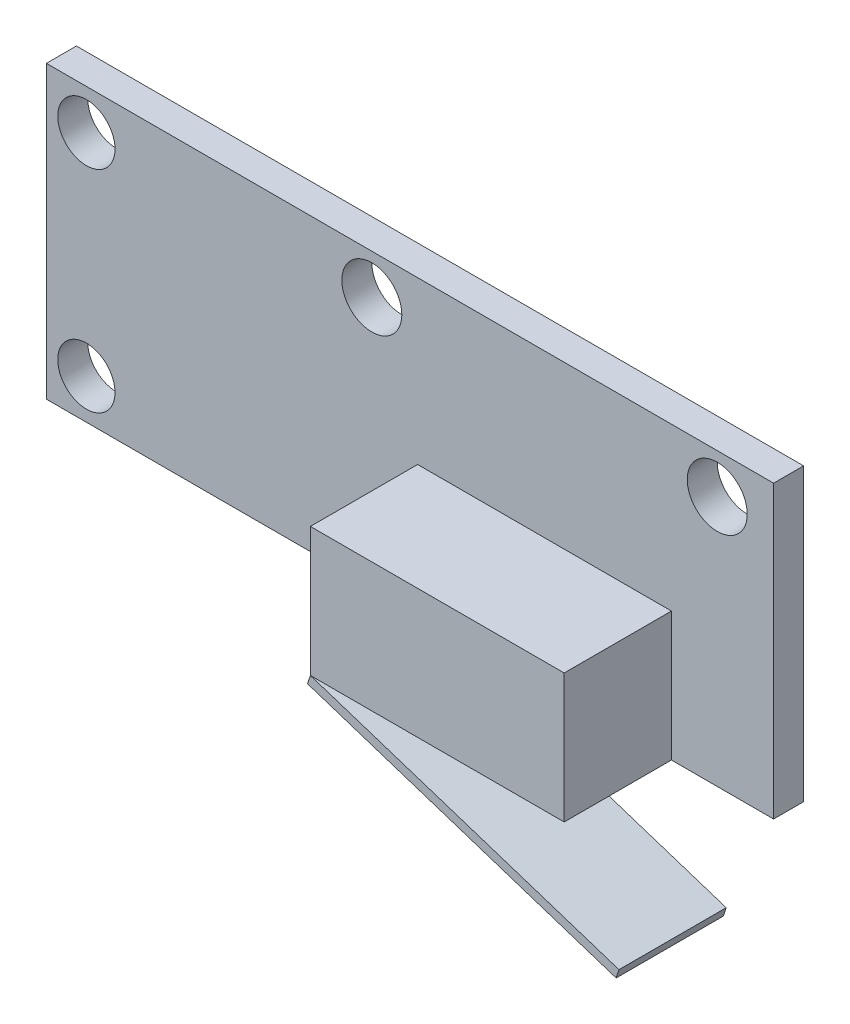
ISO-10303-21;
HEADER;
FILE_DESCRIPTION(('STEP AP214'),'2;1');
FILE_NAME('part.step','',(''),(''),'','','');
FILE_SCHEMA(('AUTOMOTIVE_DESIGN { 1 0 10303 214 1 1 1 1 }'));
ENDSEC;
DATA;
#1=APPLICATION_CONTEXT('core data for automotive mechanical design processes');
#2=APPLICATION_PROTOCOL_DEFINITION('international standard','automotive_design',2000,#1);
#3=PRODUCT_CONTEXT('',#1,'mechanical');
#4=PRODUCT('Part','Part','',(#3));
#5=PRODUCT_RELATED_PRODUCT_CATEGORY('part','',(#4));
#6=PRODUCT_DEFINITION_FORMATION('','',#4);
#7=PRODUCT_DEFINITION_CONTEXT('part definition',#1,'design');
#8=PRODUCT_DEFINITION('design','',#6,#7);
#9=PRODUCT_DEFINITION_SHAPE('','',#8);
#10=(LENGTH_UNIT() NAMED_UNIT(*) SI_UNIT(.MILLI.,.METRE.));
#11=(NAMED_UNIT(*) PLANE_ANGLE_UNIT() SI_UNIT($,.RADIAN.));
#12=(NAMED_UNIT(*) SI_UNIT($,.STERADIAN.) SOLID_ANGLE_UNIT());
#13=UNCERTAINTY_MEASURE_WITH_UNIT(LENGTH_MEASURE(1.E-05),#10,'distance_accuracy_value','');
#14=(GEOMETRIC_REPRESENTATION_CONTEXT(3) GLOBAL_UNCERTAINTY_ASSIGNED_CONTEXT((#13)) GLOBAL_UNIT_ASSIGNED_CONTEXT((#10,
#11,#12)) REPRESENTATION_CONTEXT('',''));
#15=CARTESIAN_POINT('',(0.,0.,0.));
#16=DIRECTION('',(0.,0.,1.));
#17=DIRECTION('',(1.,0.,0.));
#18=AXIS2_PLACEMENT_3D('',#15,#16,#17);
#19=CARTESIAN_POINT('',(20.2644251272537,-0.47543198853105,7.55));
#20=DIRECTION('',(0.309608942257238,0.9508639770621,0.));
#21=DIRECTION('',(-0.9508639770621,0.309608942257239,0.));
#22=AXIS2_PLACEMENT_3D('',#19,#20,#21);
#23=PLANE('',#22);
#24=DIRECTION('',(0.9508639770621,-0.309608942257239,0.));
#25=VECTOR('',#24,1.);
#26=CARTESIAN_POINT('',(20.2644251272537,-0.47543198853105,1.65));
#27=LINE('',#26,#25);
#28=CARTESIAN_POINT('',(20.2644251272537,-0.47543198853105,1.65));
#29=VERTEX_POINT('',#28);
#30=CARTESIAN_POINT('',(37.2392644095884,-6.00257589341268,1.65));
#31=VERTEX_POINT('',#30);
#32=EDGE_CURVE('E106',#29,#31,#27,.T.);
#33=ORIENTED_EDGE('',*,*,#32,.T.);
#34=DIRECTION('',(0.,0.,-1.));
#35=VECTOR('',#34,1.);
#36=CARTESIAN_POINT('',(37.2392644095884,-6.00257589341268,7.55));
#37=LINE('',#36,#35);
#38=CARTESIAN_POINT('',(37.2392644095884,-6.00257589341268,7.55));
#39=VERTEX_POINT('',#38);
#40=EDGE_CURVE('E12',#39,#31,#37,.T.);
#41=ORIENTED_EDGE('',*,*,#40,.F.);
#42=DIRECTION('',(0.9508639770621,-0.309608942257239,0.));
#43=VECTOR('',#42,1.);
#44=CARTESIAN_POINT('',(20.2644251272537,-0.47543198853105,7.55));
#45=LINE('',#44,#43);
#46=CARTESIAN_POINT('',(20.2644251272537,-0.47543198853105,7.55));
#47=VERTEX_POINT('',#46);
#48=EDGE_CURVE('E83',#47,#39,#45,.T.);
#49=ORIENTED_EDGE('',*,*,#48,.F.);
#50=DIRECTION('',(0.,0.,-1.));
#51=VECTOR('',#50,1.);
#52=CARTESIAN_POINT('',(20.2644251272537,-0.47543198853105,7.55));
#53=LINE('',#52,#51);
#54=EDGE_CURVE('E59',#47,#29,#53,.T.);
#55=ORIENTED_EDGE('',*,*,#54,.T.);
#56=EDGE_LOOP('',(#33,#41,#49,#55));
#57=FACE_BOUND('',#56,.T.);
#58=ADVANCED_FACE('F43',(#57),#23,.F.);
#59=CARTESIAN_POINT('',(37.3940688807171,-5.52714390488163,7.55));
#60=DIRECTION('',(0.950863977062102,-0.309608942257234,0.));
#61=DIRECTION('',(0.309608942257234,0.950863977062102,0.));
#62=AXIS2_PLACEMENT_3D('',#59,#60,#61);
#63=PLANE('',#62);
#64=DIRECTION('',(-0.309608942257234,-0.950863977062102,0.));
#65=VECTOR('',#64,1.);
#66=CARTESIAN_POINT('',(37.3940688807171,-5.52714390488163,1.65));
#67=LINE('',#66,#65);
#68=CARTESIAN_POINT('',(37.3940688807171,-5.52714390488163,1.65));
#69=VERTEX_POINT('',#68);
#70=EDGE_CURVE('E92',#69,#31,#67,.T.);
#71=ORIENTED_EDGE('',*,*,#70,.F.);
#72=DIRECTION('',(0.,0.,-1.));
#73=VECTOR('',#72,1.);
#74=CARTESIAN_POINT('',(37.3940688807171,-5.52714390488163,7.55));
#75=LINE('',#74,#73);
#76=CARTESIAN_POINT('',(37.3940688807171,-5.52714390488163,7.55));
#77=VERTEX_POINT('',#76);
#78=EDGE_CURVE('E51',#77,#69,#75,.T.);
#79=ORIENTED_EDGE('',*,*,#78,.F.);
#80=DIRECTION('',(-0.309608942257234,-0.950863977062102,0.));
#81=VECTOR('',#80,1.);
#82=CARTESIAN_POINT('',(37.3940688807171,-5.52714390488163,7.55));
#83=LINE('',#82,#81);
#84=EDGE_CURVE('E90',#77,#39,#83,.T.);
#85=ORIENTED_EDGE('',*,*,#84,.T.);
#86=ORIENTED_EDGE('',*,*,#40,.T.);
#87=EDGE_LOOP('',(#71,#79,#85,#86));
#88=FACE_BOUND('',#87,.T.);
#89=ADVANCED_FACE('F89',(#88),#63,.T.);
#90=CARTESIAN_POINT('',(20.4192295983823,0.,7.55));
#91=DIRECTION('',(0.309608942257238,0.9508639770621,0.));
#92=DIRECTION('',(-0.9508639770621,0.309608942257239,0.));
#93=AXIS2_PLACEMENT_3D('',#90,#91,#92);
#94=PLANE('',#93);
#95=DIRECTION('',(0.9508639770621,-0.309608942257239,0.));
#96=VECTOR('',#95,1.);
#97=CARTESIAN_POINT('',(20.4192295983823,0.,1.65));
#98=LINE('',#97,#96);
#99=CARTESIAN_POINT('',(20.4192295983823,0.,1.65));
#100=VERTEX_POINT('',#99);
#101=EDGE_CURVE('E109',#100,#69,#98,.T.);
#102=ORIENTED_EDGE('',*,*,#101,.F.);
#103=DIRECTION('',(0.,0.,-1.));
#104=VECTOR('',#103,1.);
#105=CARTESIAN_POINT('',(20.4192295983823,0.,7.55));
#106=LINE('',#105,#104);
#107=CARTESIAN_POINT('',(20.4192295983823,0.,7.55));
#108=VERTEX_POINT('',#107);
#109=EDGE_CURVE('E72',#108,#100,#106,.T.);
#110=ORIENTED_EDGE('',*,*,#109,.F.);
#111=DIRECTION('',(0.9508639770621,-0.309608942257239,0.));
#112=VECTOR('',#111,1.);
#113=CARTESIAN_POINT('',(20.4192295983823,0.,7.55));
#114=LINE('',#113,#112);
#115=EDGE_CURVE('E98',#108,#77,#114,.T.);
#116=ORIENTED_EDGE('',*,*,#115,.T.);
#117=ORIENTED_EDGE('',*,*,#78,.T.);
#118=EDGE_LOOP('',(#102,#110,#116,#117));
#119=FACE_BOUND('',#118,.T.);
#120=ADVANCED_FACE('F100',(#119),#94,.T.);
#121=CARTESIAN_POINT('',(20.2644251272537,-0.47543198853105,7.55));
#122=DIRECTION('',(-0.950863977062099,0.30960894225724,0.));
#123=DIRECTION('',(-0.30960894225724,-0.9508639770621,0.));
#124=AXIS2_PLACEMENT_3D('',#121,#122,#123);
#125=PLANE('',#124);
#126=DIRECTION('',(0.30960894225724,0.950863977062099,0.));
#127=VECTOR('',#126,1.);
#128=CARTESIAN_POINT('',(20.2644251272537,-0.47543198853105,1.65));
#129=LINE('',#128,#127);
#130=EDGE_CURVE('E111',#29,#100,#129,.T.);
#131=ORIENTED_EDGE('',*,*,#130,.F.);
#132=ORIENTED_EDGE('',*,*,#54,.F.);
#133=DIRECTION('',(0.30960894225724,0.950863977062099,0.));
#134=VECTOR('',#133,1.);
#135=CARTESIAN_POINT('',(20.2644251272537,-0.47543198853105,7.55));
#136=LINE('',#135,#134);
#137=EDGE_CURVE('E101',#47,#108,#136,.T.);
#138=ORIENTED_EDGE('',*,*,#137,.T.);
#139=ORIENTED_EDGE('',*,*,#109,.T.);
#140=EDGE_LOOP('',(#131,#132,#138,#139));
#141=FACE_BOUND('',#140,.T.);
#142=ADVANCED_FACE('F117',(#141),#125,.T.);
#143=CARTESIAN_POINT('',(0.,0.,7.55));
#144=DIRECTION('',(0.,0.,-1.));
#145=DIRECTION('',(-1.,0.,0.));
#146=AXIS2_PLACEMENT_3D('',#143,#144,#145);
#147=PLANE('',#146);
#148=ORIENTED_EDGE('',*,*,#48,.T.);
#149=ORIENTED_EDGE('',*,*,#84,.F.);
#150=ORIENTED_EDGE('',*,*,#115,.F.);
#151=ORIENTED_EDGE('',*,*,#137,.F.);
#152=EDGE_LOOP('',(#148,#149,#150,#151));
#153=FACE_BOUND('',#152,.T.);
#154=ADVANCED_FACE('F97',(#153),#147,.F.);
#155=CARTESIAN_POINT('',(0.,0.,1.65));
#156=DIRECTION('',(0.,0.,-1.));
#157=DIRECTION('',(-1.,0.,0.));
#158=AXIS2_PLACEMENT_3D('',#155,#156,#157);
#159=PLANE('',#158);
#160=ORIENTED_EDGE('',*,*,#32,.F.);
#161=ORIENTED_EDGE('',*,*,#130,.T.);
#162=ORIENTED_EDGE('',*,*,#101,.T.);
#163=ORIENTED_EDGE('',*,*,#70,.T.);
#164=EDGE_LOOP('',(#160,#161,#162,#163));
#165=FACE_BOUND('',#164,.T.);
#166=ADVANCED_FACE('F116',(#165),#159,.T.);
#167=CLOSED_SHELL('',(#58,#89,#120,#142,#154,#166));
#168=MANIFOLD_SOLID_BREP('B2',#167);
#169=CARTESIAN_POINT('',(0.,0.,1.65));
#170=DIRECTION('',(0.,0.,-1.));
#171=DIRECTION('',(-1.,0.,0.));
#172=AXIS2_PLACEMENT_3D('',#169,#170,#171);
#173=PLANE('',#172);
#174=CARTESIAN_POINT('',(2.2,2.2,1.65));
#175=DIRECTION('',(0.,0.,1.));
#176=DIRECTION('',(-1.,0.,0.));
#177=AXIS2_PLACEMENT_3D('',#174,#175,#176);
#178=CIRCLE('',#177,1.575);
#179=CARTESIAN_POINT('',(0.625000000000001,2.2,1.65));
#180=VERTEX_POINT('',#179);
#181=EDGE_CURVE('E258',#180,#180,#178,.T.);
#182=ORIENTED_EDGE('',*,*,#181,.F.);
#183=EDGE_LOOP('',(#182));
#184=FACE_BOUND('',#183,.T.);
#185=CARTESIAN_POINT('',(17.9,13.8,1.65));
#186=DIRECTION('',(0.,0.,1.));
#187=DIRECTION('',(1.,0.,0.));
#188=AXIS2_PLACEMENT_3D('',#185,#186,#187);
#189=CIRCLE('',#188,1.65);
#190=CARTESIAN_POINT('',(19.55,13.8,1.65));
#191=VERTEX_POINT('',#190);
#192=EDGE_CURVE('E340',#191,#191,#189,.T.);
#193=ORIENTED_EDGE('',*,*,#192,.F.);
#194=EDGE_LOOP('',(#193));
#195=FACE_BOUND('',#194,.T.);
#196=CARTESIAN_POINT('',(36.9,13.8,1.65));
#197=DIRECTION('',(0.,0.,1.));
#198=DIRECTION('',(1.,0.,0.));
#199=AXIS2_PLACEMENT_3D('',#196,#197,#198);
#200=CIRCLE('',#199,1.65);
#201=CARTESIAN_POINT('',(38.55,13.8,1.65));
#202=VERTEX_POINT('',#201);
#203=EDGE_CURVE('E288',#202,#202,#200,.T.);
#204=ORIENTED_EDGE('',*,*,#203,.F.);
#205=EDGE_LOOP('',(#204));
#206=FACE_BOUND('',#205,.T.);
#207=CARTESIAN_POINT('',(2.2,13.8,1.65));
#208=DIRECTION('',(0.,0.,1.));
#209=DIRECTION('',(1.,0.,0.));
#210=AXIS2_PLACEMENT_3D('',#207,#208,#209);
#211=CIRCLE('',#210,1.575);
#212=CARTESIAN_POINT('',(3.775,13.8,1.65));
#213=VERTEX_POINT('',#212);
#214=EDGE_CURVE('E334',#213,#213,#211,.T.);
#215=ORIENTED_EDGE('',*,*,#214,.F.);
#216=EDGE_LOOP('',(#215));
#217=FACE_BOUND('',#216,.T.);
#218=DIRECTION('',(0.,-1.,0.));
#219=VECTOR('',#218,1.);
#220=CARTESIAN_POINT('',(20.4192295983823,0.,1.65));
#221=LINE('',#220,#219);
#222=CARTESIAN_POINT('',(20.4192295983823,7.09930181705687,1.65));
#223=VERTEX_POINT('',#222);
#224=CARTESIAN_POINT('',(20.4192295983823,0.,1.65));
#225=VERTEX_POINT('',#224);
#226=EDGE_CURVE('E171',#223,#225,#221,.T.);
#227=ORIENTED_EDGE('',*,*,#226,.F.);
#228=DIRECTION('',(-1.,0.,0.));
#229=VECTOR('',#228,1.);
#230=CARTESIAN_POINT('',(34.3807704016177,7.09930181705687,1.65));
#231=LINE('',#230,#229);
#232=CARTESIAN_POINT('',(34.3807704016177,7.09930181705687,1.65));
#233=VERTEX_POINT('',#232);
#234=EDGE_CURVE('E252',#233,#223,#231,.T.);
#235=ORIENTED_EDGE('',*,*,#234,.F.);
#236=DIRECTION('',(0.,1.,0.));
#237=VECTOR('',#236,1.);
#238=CARTESIAN_POINT('',(34.3807704016177,0.,1.65));
#239=LINE('',#238,#237);
#240=CARTESIAN_POINT('',(34.3807704016177,0.,1.65));
#241=VERTEX_POINT('',#240);
#242=EDGE_CURVE('E190',#241,#233,#239,.T.);
#243=ORIENTED_EDGE('',*,*,#242,.F.);
#244=DIRECTION('',(1.,0.,0.));
#245=VECTOR('',#244,1.);
#246=CARTESIAN_POINT('',(0.,0.,1.65));
#247=LINE('',#246,#245);
#248=CARTESIAN_POINT('',(40.,0.,1.65));
#249=VERTEX_POINT('',#248);
#250=EDGE_CURVE('E269',#241,#249,#247,.T.);
#251=ORIENTED_EDGE('',*,*,#250,.T.);
#252=DIRECTION('',(0.,1.,0.));
#253=VECTOR('',#252,1.);
#254=CARTESIAN_POINT('',(40.,0.,1.65));
#255=LINE('',#254,#253);
#256=CARTESIAN_POINT('',(40.,16.,1.65));
#257=VERTEX_POINT('',#256);
#258=EDGE_CURVE('E278',#249,#257,#255,.T.);
#259=ORIENTED_EDGE('',*,*,#258,.T.);
#260=DIRECTION('',(-1.,0.,0.));
#261=VECTOR('',#260,1.);
#262=CARTESIAN_POINT('',(0.,16.,1.65));
#263=LINE('',#262,#261);
#264=CARTESIAN_POINT('',(0.,16.,1.65));
#265=VERTEX_POINT('',#264);
#266=EDGE_CURVE('E281',#257,#265,#263,.T.);
#267=ORIENTED_EDGE('',*,*,#266,.T.);
#268=DIRECTION('',(0.,-1.,0.));
#269=VECTOR('',#268,1.);
#270=CARTESIAN_POINT('',(0.,0.,1.65));
#271=LINE('',#270,#269);
#272=CARTESIAN_POINT('',(0.,0.,1.65));
#273=VERTEX_POINT('',#272);
#274=EDGE_CURVE('E273',#265,#273,#271,.T.);
#275=ORIENTED_EDGE('',*,*,#274,.T.);
#276=EDGE_CURVE('E272',#273,#225,#247,.T.);
#277=ORIENTED_EDGE('',*,*,#276,.T.);
#278=EDGE_LOOP('',(#227,#235,#243,#251,#259,#267,#275,#277));
#279=FACE_BOUND('',#278,.T.);
#280=ADVANCED_FACE('F167',(#184,#195,#206,#217,#279),#173,.F.);
#281=CARTESIAN_POINT('',(0.,0.,0.));
#282=DIRECTION('',(0.,0.,-1.));
#283=DIRECTION('',(-1.,0.,0.));
#284=AXIS2_PLACEMENT_3D('',#281,#282,#283);
#285=PLANE('',#284);
#286=CARTESIAN_POINT('',(2.2,13.8,0.));
#287=DIRECTION('',(0.,0.,1.));
#288=DIRECTION('',(1.,0.,0.));
#289=AXIS2_PLACEMENT_3D('',#286,#287,#288);
#290=CIRCLE('',#289,1.575);
#291=CARTESIAN_POINT('',(3.775,13.8,0.));
#292=VERTEX_POINT('',#291);
#293=EDGE_CURVE('E332',#292,#292,#290,.T.);
#294=ORIENTED_EDGE('',*,*,#293,.T.);
#295=EDGE_LOOP('',(#294));
#296=FACE_BOUND('',#295,.T.);
#297=CARTESIAN_POINT('',(36.9,13.8,0.));
#298=DIRECTION('',(0.,0.,1.));
#299=DIRECTION('',(1.,0.,0.));
#300=AXIS2_PLACEMENT_3D('',#297,#298,#299);
#301=CIRCLE('',#300,1.65);
#302=CARTESIAN_POINT('',(38.55,13.8,0.));
#303=VERTEX_POINT('',#302);
#304=EDGE_CURVE('E343',#303,#303,#301,.T.);
#305=ORIENTED_EDGE('',*,*,#304,.T.);
#306=EDGE_LOOP('',(#305));
#307=FACE_BOUND('',#306,.T.);
#308=DIRECTION('',(0.,-1.,0.));
#309=VECTOR('',#308,1.);
#310=CARTESIAN_POINT('',(0.,0.,0.));
#311=LINE('',#310,#309);
#312=CARTESIAN_POINT('',(0.,16.,0.));
#313=VERTEX_POINT('',#312);
#314=CARTESIAN_POINT('',(0.,0.,0.));
#315=VERTEX_POINT('',#314);
#316=EDGE_CURVE('E284',#313,#315,#311,.T.);
#317=ORIENTED_EDGE('',*,*,#316,.F.);
#318=DIRECTION('',(-1.,0.,0.));
#319=VECTOR('',#318,1.);
#320=CARTESIAN_POINT('',(0.,16.,0.));
#321=LINE('',#320,#319);
#322=CARTESIAN_POINT('',(40.,16.,0.));
#323=VERTEX_POINT('',#322);
#324=EDGE_CURVE('E292',#323,#313,#321,.T.);
#325=ORIENTED_EDGE('',*,*,#324,.F.);
#326=DIRECTION('',(0.,1.,0.));
#327=VECTOR('',#326,1.);
#328=CARTESIAN_POINT('',(40.,0.,0.));
#329=LINE('',#328,#327);
#330=CARTESIAN_POINT('',(40.,0.,0.));
#331=VERTEX_POINT('',#330);
#332=EDGE_CURVE('E290',#331,#323,#329,.T.);
#333=ORIENTED_EDGE('',*,*,#332,.F.);
#334=DIRECTION('',(1.,0.,0.));
#335=VECTOR('',#334,1.);
#336=CARTESIAN_POINT('',(0.,0.,0.));
#337=LINE('',#336,#335);
#338=EDGE_CURVE('E287',#315,#331,#337,.T.);
#339=ORIENTED_EDGE('',*,*,#338,.F.);
#340=EDGE_LOOP('',(#317,#325,#333,#339));
#341=FACE_BOUND('',#340,.T.);
#342=CARTESIAN_POINT('',(17.9,13.8,0.));
#343=DIRECTION('',(0.,0.,1.));
#344=DIRECTION('',(1.,0.,0.));
#345=AXIS2_PLACEMENT_3D('',#342,#343,#344);
#346=CIRCLE('',#345,1.65);
#347=CARTESIAN_POINT('',(19.55,13.8,0.));
#348=VERTEX_POINT('',#347);
#349=EDGE_CURVE('E337',#348,#348,#346,.T.);
#350=ORIENTED_EDGE('',*,*,#349,.T.);
#351=EDGE_LOOP('',(#350));
#352=FACE_BOUND('',#351,.T.);
#353=CARTESIAN_POINT('',(2.2,2.2,0.));
#354=DIRECTION('',(0.,0.,1.));
#355=DIRECTION('',(-1.,0.,0.));
#356=AXIS2_PLACEMENT_3D('',#353,#354,#355);
#357=CIRCLE('',#356,1.575);
#358=CARTESIAN_POINT('',(0.625000000000001,2.2,0.));
#359=VERTEX_POINT('',#358);
#360=EDGE_CURVE('E255',#359,#359,#357,.T.);
#361=ORIENTED_EDGE('',*,*,#360,.T.);
#362=EDGE_LOOP('',(#361));
#363=FACE_BOUND('',#362,.T.);
#364=ADVANCED_FACE('F309',(#296,#307,#341,#352,#363),#285,.T.);
#365=CARTESIAN_POINT('',(0.,0.,1.65));
#366=DIRECTION('',(1.,0.,0.));
#367=DIRECTION('',(0.,1.,0.));
#368=AXIS2_PLACEMENT_3D('',#365,#366,#367);
#369=PLANE('',#368);
#370=ORIENTED_EDGE('',*,*,#316,.T.);
#371=DIRECTION('',(0.,0.,-1.));
#372=VECTOR('',#371,1.);
#373=CARTESIAN_POINT('',(0.,0.,1.65));
#374=LINE('',#373,#372);
#375=EDGE_CURVE('E41',#273,#315,#374,.T.);
#376=ORIENTED_EDGE('',*,*,#375,.F.);
#377=ORIENTED_EDGE('',*,*,#274,.F.);
#378=DIRECTION('',(0.,0.,-1.));
#379=VECTOR('',#378,1.);
#380=CARTESIAN_POINT('',(0.,16.,1.65));
#381=LINE('',#380,#379);
#382=EDGE_CURVE('E283',#265,#313,#381,.T.);
#383=ORIENTED_EDGE('',*,*,#382,.T.);
#384=EDGE_LOOP('',(#370,#376,#377,#383));
#385=FACE_BOUND('',#384,.T.);
#386=ADVANCED_FACE('F169',(#385),#369,.F.);
#387=CARTESIAN_POINT('',(0.,0.,1.65));
#388=DIRECTION('',(0.,1.,0.));
#389=DIRECTION('',(0.,0.,1.));
#390=AXIS2_PLACEMENT_3D('',#387,#388,#389);
#391=PLANE('',#390);
#392=ORIENTED_EDGE('',*,*,#338,.T.);
#393=DIRECTION('',(0.,0.,-1.));
#394=VECTOR('',#393,1.);
#395=CARTESIAN_POINT('',(40.,0.,1.65));
#396=LINE('',#395,#394);
#397=EDGE_CURVE('E177',#249,#331,#396,.T.);
#398=ORIENTED_EDGE('',*,*,#397,.F.);
#399=ORIENTED_EDGE('',*,*,#250,.F.);
#400=DIRECTION('',(0.,0.,-1.));
#401=VECTOR('',#400,1.);
#402=CARTESIAN_POINT('',(34.3807704016177,0.,7.55));
#403=LINE('',#402,#401);
#404=CARTESIAN_POINT('',(34.3807704016177,0.,7.55));
#405=VERTEX_POINT('',#404);
#406=EDGE_CURVE('E239',#405,#241,#403,.T.);
#407=ORIENTED_EDGE('',*,*,#406,.F.);
#408=DIRECTION('',(1.,0.,0.));
#409=VECTOR('',#408,1.);
#410=CARTESIAN_POINT('',(34.3807704016177,0.,7.55));
#411=LINE('',#410,#409);
#412=CARTESIAN_POINT('',(20.4192295983823,0.,7.55));
#413=VERTEX_POINT('',#412);
#414=EDGE_CURVE('E233',#413,#405,#411,.T.);
#415=ORIENTED_EDGE('',*,*,#414,.F.);
#416=DIRECTION('',(0.,0.,-1.));
#417=VECTOR('',#416,1.);
#418=CARTESIAN_POINT('',(20.4192295983823,0.,7.55));
#419=LINE('',#418,#417);
#420=EDGE_CURVE('E237',#413,#225,#419,.T.);
#421=ORIENTED_EDGE('',*,*,#420,.T.);
#422=ORIENTED_EDGE('',*,*,#276,.F.);
#423=ORIENTED_EDGE('',*,*,#375,.T.);
#424=EDGE_LOOP('',(#392,#398,#399,#407,#415,#421,#422,#423));
#425=FACE_BOUND('',#424,.T.);
#426=ADVANCED_FACE('F235',(#425),#391,.F.);
#427=CARTESIAN_POINT('',(40.,0.,1.65));
#428=DIRECTION('',(-1.,0.,0.));
#429=DIRECTION('',(0.,-1.,0.));
#430=AXIS2_PLACEMENT_3D('',#427,#428,#429);
#431=PLANE('',#430);
#432=ORIENTED_EDGE('',*,*,#332,.T.);
#433=DIRECTION('',(0.,0.,-1.));
#434=VECTOR('',#433,1.);
#435=CARTESIAN_POINT('',(40.,16.,1.65));
#436=LINE('',#435,#434);
#437=EDGE_CURVE('E296',#257,#323,#436,.T.);
#438=ORIENTED_EDGE('',*,*,#437,.F.);
#439=ORIENTED_EDGE('',*,*,#258,.F.);
#440=ORIENTED_EDGE('',*,*,#397,.T.);
#441=EDGE_LOOP('',(#432,#438,#439,#440));
#442=FACE_BOUND('',#441,.T.);
#443=ADVANCED_FACE('F304',(#442),#431,.F.);
#444=CARTESIAN_POINT('',(0.,16.,1.65));
#445=DIRECTION('',(0.,-1.,0.));
#446=DIRECTION('',(0.,0.,-1.));
#447=AXIS2_PLACEMENT_3D('',#444,#445,#446);
#448=PLANE('',#447);
#449=ORIENTED_EDGE('',*,*,#324,.T.);
#450=ORIENTED_EDGE('',*,*,#382,.F.);
#451=ORIENTED_EDGE('',*,*,#266,.F.);
#452=ORIENTED_EDGE('',*,*,#437,.T.);
#453=EDGE_LOOP('',(#449,#450,#451,#452));
#454=FACE_BOUND('',#453,.T.);
#455=ADVANCED_FACE('F313',(#454),#448,.F.);
#456=CARTESIAN_POINT('',(36.9,13.8,1.65));
#457=DIRECTION('',(0.,0.,-1.));
#458=DIRECTION('',(-1.,0.,0.));
#459=AXIS2_PLACEMENT_3D('',#456,#457,#458);
#460=CYLINDRICAL_SURFACE('',#459,1.65);
#461=ORIENTED_EDGE('',*,*,#203,.T.);
#462=EDGE_LOOP('',(#461));
#463=FACE_BOUND('',#462,.T.);
#464=ORIENTED_EDGE('',*,*,#304,.F.);
#465=EDGE_LOOP('',(#464));
#466=FACE_BOUND('',#465,.T.);
#467=ADVANCED_FACE('F351',(#463,#466),#460,.F.);
#468=CARTESIAN_POINT('',(17.9,13.8,1.65));
#469=DIRECTION('',(0.,0.,-1.));
#470=DIRECTION('',(-1.,0.,0.));
#471=AXIS2_PLACEMENT_3D('',#468,#469,#470);
#472=CYLINDRICAL_SURFACE('',#471,1.65);
#473=ORIENTED_EDGE('',*,*,#192,.T.);
#474=EDGE_LOOP('',(#473));
#475=FACE_BOUND('',#474,.T.);
#476=ORIENTED_EDGE('',*,*,#349,.F.);
#477=EDGE_LOOP('',(#476));
#478=FACE_BOUND('',#477,.T.);
#479=ADVANCED_FACE('F353',(#475,#478),#472,.F.);
#480=CARTESIAN_POINT('',(2.2,13.8,1.65));
#481=DIRECTION('',(0.,0.,-1.));
#482=DIRECTION('',(-1.,0.,0.));
#483=AXIS2_PLACEMENT_3D('',#480,#481,#482);
#484=CYLINDRICAL_SURFACE('',#483,1.575);
#485=ORIENTED_EDGE('',*,*,#214,.T.);
#486=EDGE_LOOP('',(#485));
#487=FACE_BOUND('',#486,.T.);
#488=ORIENTED_EDGE('',*,*,#293,.F.);
#489=EDGE_LOOP('',(#488));
#490=FACE_BOUND('',#489,.T.);
#491=ADVANCED_FACE('F360',(#487,#490),#484,.F.);
#492=CARTESIAN_POINT('',(2.2,2.2,1.65));
#493=DIRECTION('',(0.,0.,-1.));
#494=DIRECTION('',(-1.,0.,0.));
#495=AXIS2_PLACEMENT_3D('',#492,#493,#494);
#496=CYLINDRICAL_SURFACE('',#495,1.575);
#497=ORIENTED_EDGE('',*,*,#181,.T.);
#498=EDGE_LOOP('',(#497));
#499=FACE_BOUND('',#498,.T.);
#500=ORIENTED_EDGE('',*,*,#360,.F.);
#501=EDGE_LOOP('',(#500));
#502=FACE_BOUND('',#501,.T.);
#503=ADVANCED_FACE('F425',(#499,#502),#496,.F.);
#504=CARTESIAN_POINT('',(20.4192295983823,0.,7.55));
#505=DIRECTION('',(1.,0.,0.));
#506=DIRECTION('',(0.,0.,-1.));
#507=AXIS2_PLACEMENT_3D('',#504,#505,#506);
#508=PLANE('',#507);
#509=ORIENTED_EDGE('',*,*,#226,.T.);
#510=ORIENTED_EDGE('',*,*,#420,.F.);
#511=DIRECTION('',(0.,-1.,0.));
#512=VECTOR('',#511,1.);
#513=CARTESIAN_POINT('',(20.4192295983823,0.,7.55));
#514=LINE('',#513,#512);
#515=CARTESIAN_POINT('',(20.4192295983823,7.09930181705687,7.55));
#516=VERTEX_POINT('',#515);
#517=EDGE_CURVE('E243',#516,#413,#514,.T.);
#518=ORIENTED_EDGE('',*,*,#517,.F.);
#519=DIRECTION('',(0.,0.,-1.));
#520=VECTOR('',#519,1.);
#521=CARTESIAN_POINT('',(20.4192295983823,7.09930181705687,7.55));
#522=LINE('',#521,#520);
#523=EDGE_CURVE('E324',#516,#223,#522,.T.);
#524=ORIENTED_EDGE('',*,*,#523,.T.);
#525=EDGE_LOOP('',(#509,#510,#518,#524));
#526=FACE_BOUND('',#525,.T.);
#527=ADVANCED_FACE('F254',(#526),#508,.F.);
#528=CARTESIAN_POINT('',(34.3807704016177,0.,7.55));
#529=DIRECTION('',(-1.,0.,0.));
#530=DIRECTION('',(0.,0.,1.));
#531=AXIS2_PLACEMENT_3D('',#528,#529,#530);
#532=PLANE('',#531);
#533=ORIENTED_EDGE('',*,*,#242,.T.);
#534=DIRECTION('',(0.,0.,-1.));
#535=VECTOR('',#534,1.);
#536=CARTESIAN_POINT('',(34.3807704016177,7.09930181705687,7.55));
#537=LINE('',#536,#535);
#538=CARTESIAN_POINT('',(34.3807704016177,7.09930181705687,7.55));
#539=VERTEX_POINT('',#538);
#540=EDGE_CURVE('E260',#539,#233,#537,.T.);
#541=ORIENTED_EDGE('',*,*,#540,.F.);
#542=DIRECTION('',(0.,1.,0.));
#543=VECTOR('',#542,1.);
#544=CARTESIAN_POINT('',(34.3807704016177,0.,7.55));
#545=LINE('',#544,#543);
#546=EDGE_CURVE('E242',#405,#539,#545,.T.);
#547=ORIENTED_EDGE('',*,*,#546,.F.);
#548=ORIENTED_EDGE('',*,*,#406,.T.);
#549=EDGE_LOOP('',(#533,#541,#547,#548));
#550=FACE_BOUND('',#549,.T.);
#551=ADVANCED_FACE('F320',(#550),#532,.F.);
#552=CARTESIAN_POINT('',(34.3807704016177,7.09930181705687,7.55));
#553=DIRECTION('',(0.,-1.,0.));
#554=DIRECTION('',(1.,0.,0.));
#555=AXIS2_PLACEMENT_3D('',#552,#553,#554);
#556=PLANE('',#555);
#557=ORIENTED_EDGE('',*,*,#234,.T.);
#558=ORIENTED_EDGE('',*,*,#523,.F.);
#559=DIRECTION('',(-1.,0.,0.));
#560=VECTOR('',#559,1.);
#561=CARTESIAN_POINT('',(34.3807704016177,7.09930181705687,7.55));
#562=LINE('',#561,#560);
#563=EDGE_CURVE('E248',#539,#516,#562,.T.);
#564=ORIENTED_EDGE('',*,*,#563,.F.);
#565=ORIENTED_EDGE('',*,*,#540,.T.);
#566=EDGE_LOOP('',(#557,#558,#564,#565));
#567=FACE_BOUND('',#566,.T.);
#568=ADVANCED_FACE('F452',(#567),#556,.F.);
#569=CARTESIAN_POINT('',(0.,0.,7.55));
#570=DIRECTION('',(0.,0.,1.));
#571=DIRECTION('',(1.,0.,0.));
#572=AXIS2_PLACEMENT_3D('',#569,#570,#571);
#573=PLANE('',#572);
#574=ORIENTED_EDGE('',*,*,#517,.T.);
#575=ORIENTED_EDGE('',*,*,#414,.T.);
#576=ORIENTED_EDGE('',*,*,#546,.T.);
#577=ORIENTED_EDGE('',*,*,#563,.T.);
#578=EDGE_LOOP('',(#574,#575,#576,#577));
#579=FACE_BOUND('',#578,.T.);
#580=ADVANCED_FACE('F246',(#579),#573,.T.);
#581=CLOSED_SHELL('',(#280,#364,#386,#426,#443,#455,#467,#479,#491,#503,#527,#551,#568,#580));
#582=MANIFOLD_SOLID_BREP('B6',#581);
#583=ADVANCED_BREP_SHAPE_REPRESENTATION('',(#18,#168,#582),#14);
#584=SHAPE_DEFINITION_REPRESENTATION(#9,#583);
ENDSEC;
END-ISO-10303-21;
